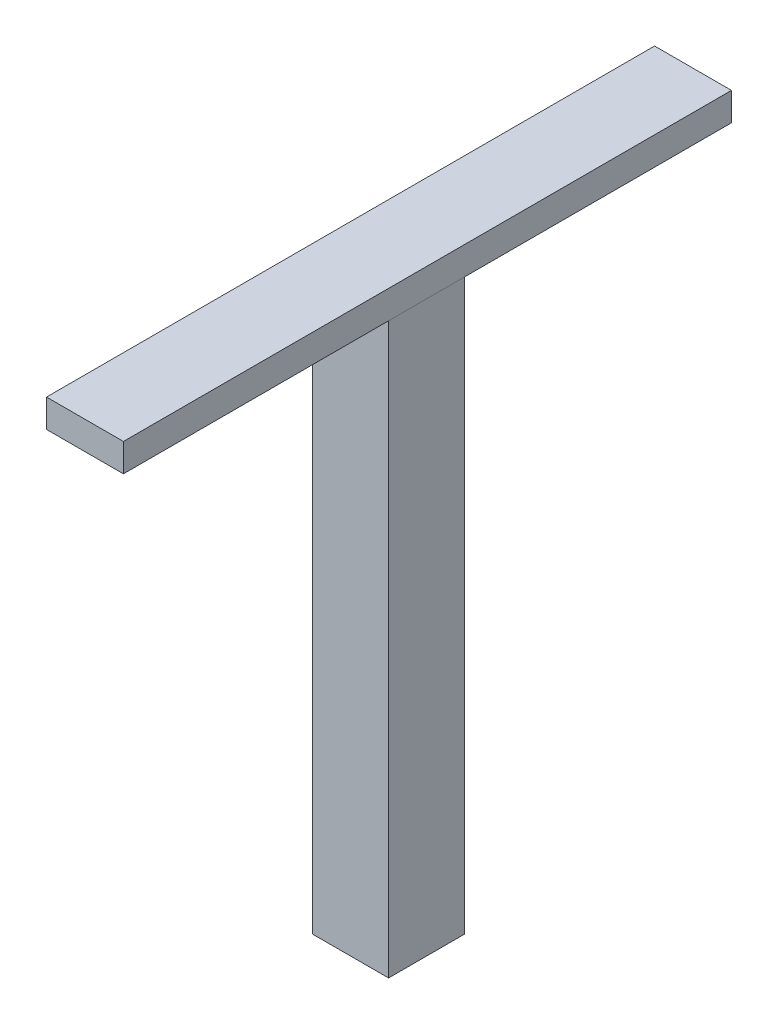
ISO-10303-21;
HEADER;
FILE_DESCRIPTION(('STEP AP214'),'2;1');
FILE_NAME('part.step','',(''),(''),'','','');
FILE_SCHEMA(('AUTOMOTIVE_DESIGN { 1 0 10303 214 1 1 1 1 }'));
ENDSEC;
DATA;
#1=APPLICATION_CONTEXT('core data for automotive mechanical design processes');
#2=APPLICATION_PROTOCOL_DEFINITION('international standard','automotive_design',2000,#1);
#3=PRODUCT_CONTEXT('',#1,'mechanical');
#4=PRODUCT('Part','Part','',(#3));
#5=PRODUCT_RELATED_PRODUCT_CATEGORY('part','',(#4));
#6=PRODUCT_DEFINITION_FORMATION('','',#4);
#7=PRODUCT_DEFINITION_CONTEXT('part definition',#1,'design');
#8=PRODUCT_DEFINITION('design','',#6,#7);
#9=PRODUCT_DEFINITION_SHAPE('','',#8);
#10=(LENGTH_UNIT() NAMED_UNIT(*) SI_UNIT(.MILLI.,.METRE.));
#11=(NAMED_UNIT(*) PLANE_ANGLE_UNIT() SI_UNIT($,.RADIAN.));
#12=(NAMED_UNIT(*) SI_UNIT($,.STERADIAN.) SOLID_ANGLE_UNIT());
#13=UNCERTAINTY_MEASURE_WITH_UNIT(LENGTH_MEASURE(1.E-05),#10,'distance_accuracy_value','');
#14=(GEOMETRIC_REPRESENTATION_CONTEXT(3) GLOBAL_UNCERTAINTY_ASSIGNED_CONTEXT((#13)) GLOBAL_UNIT_ASSIGNED_CONTEXT((#10,
#11,#12)) REPRESENTATION_CONTEXT('',''));
#15=CARTESIAN_POINT('',(0.,0.,0.));
#16=DIRECTION('',(0.,0.,1.));
#17=DIRECTION('',(1.,0.,0.));
#18=AXIS2_PLACEMENT_3D('',#15,#16,#17);
#19=CARTESIAN_POINT('',(0.,150.,-70.));
#20=DIRECTION('',(-1.,0.,0.));
#21=DIRECTION('',(0.,0.,1.));
#22=AXIS2_PLACEMENT_3D('',#19,#20,#21);
#23=PLANE('',#22);
#24=DIRECTION('',(0.,0.,1.));
#25=VECTOR('',#24,1.);
#26=CARTESIAN_POINT('',(0.,150.,-70.));
#27=LINE('',#26,#25);
#28=CARTESIAN_POINT('',(0.,150.,-70.));
#29=VERTEX_POINT('',#28);
#30=CARTESIAN_POINT('',(0.,150.,90.));
#31=VERTEX_POINT('',#30);
#32=EDGE_CURVE('E89',#29,#31,#27,.T.);
#33=ORIENTED_EDGE('',*,*,#32,.T.);
#34=DIRECTION('',(0.,-1.,0.));
#35=VECTOR('',#34,1.);
#36=CARTESIAN_POINT('',(0.,150.,90.));
#37=LINE('',#36,#35);
#38=CARTESIAN_POINT('',(0.,157.389232752848,90.));
#39=VERTEX_POINT('',#38);
#40=EDGE_CURVE('E126',#39,#31,#37,.T.);
#41=ORIENTED_EDGE('',*,*,#40,.F.);
#42=DIRECTION('',(0.,0.,1.));
#43=VECTOR('',#42,1.);
#44=CARTESIAN_POINT('',(0.,157.389232752848,-70.));
#45=LINE('',#44,#43);
#46=CARTESIAN_POINT('',(0.,157.389232752848,-70.));
#47=VERTEX_POINT('',#46);
#48=EDGE_CURVE('E13',#47,#39,#45,.T.);
#49=ORIENTED_EDGE('',*,*,#48,.F.);
#50=DIRECTION('',(0.,-1.,0.));
#51=VECTOR('',#50,1.);
#52=CARTESIAN_POINT('',(0.,150.,-70.));
#53=LINE('',#52,#51);
#54=EDGE_CURVE('E127',#47,#29,#53,.T.);
#55=ORIENTED_EDGE('',*,*,#54,.T.);
#56=EDGE_LOOP('',(#33,#41,#49,#55));
#57=FACE_BOUND('',#56,.T.);
#58=ADVANCED_FACE('F86',(#57),#23,.T.);
#59=CARTESIAN_POINT('',(0.,157.389232752848,-70.));
#60=DIRECTION('',(0.,1.,0.));
#61=DIRECTION('',(0.,0.,1.));
#62=AXIS2_PLACEMENT_3D('',#59,#60,#61);
#63=PLANE('',#62);
#64=ORIENTED_EDGE('',*,*,#48,.T.);
#65=DIRECTION('',(-1.,0.,0.));
#66=VECTOR('',#65,1.);
#67=CARTESIAN_POINT('',(0.,157.389232752848,90.));
#68=LINE('',#67,#66);
#69=CARTESIAN_POINT('',(20.2324941647625,157.389232752848,90.));
#70=VERTEX_POINT('',#69);
#71=EDGE_CURVE('E143',#70,#39,#68,.T.);
#72=ORIENTED_EDGE('',*,*,#71,.F.);
#73=DIRECTION('',(0.,0.,1.));
#74=VECTOR('',#73,1.);
#75=CARTESIAN_POINT('',(20.2324941647625,157.389232752848,-70.));
#76=LINE('',#75,#74);
#77=CARTESIAN_POINT('',(20.2324941647625,157.389232752848,-70.));
#78=VERTEX_POINT('',#77);
#79=EDGE_CURVE('E94',#78,#70,#76,.T.);
#80=ORIENTED_EDGE('',*,*,#79,.F.);
#81=DIRECTION('',(-1.,0.,0.));
#82=VECTOR('',#81,1.);
#83=CARTESIAN_POINT('',(0.,157.389232752848,-70.));
#84=LINE('',#83,#82);
#85=EDGE_CURVE('E132',#78,#47,#84,.T.);
#86=ORIENTED_EDGE('',*,*,#85,.T.);
#87=EDGE_LOOP('',(#64,#72,#80,#86));
#88=FACE_BOUND('',#87,.T.);
#89=ADVANCED_FACE('F158',(#88),#63,.T.);
#90=CARTESIAN_POINT('',(20.2324941647625,150.,-70.));
#91=DIRECTION('',(1.,0.,0.));
#92=DIRECTION('',(0.,0.,-1.));
#93=AXIS2_PLACEMENT_3D('',#90,#91,#92);
#94=PLANE('',#93);
#95=ORIENTED_EDGE('',*,*,#79,.T.);
#96=DIRECTION('',(0.,1.,0.));
#97=VECTOR('',#96,1.);
#98=CARTESIAN_POINT('',(20.2324941647625,150.,90.));
#99=LINE('',#98,#97);
#100=CARTESIAN_POINT('',(20.2324941647625,150.,90.));
#101=VERTEX_POINT('',#100);
#102=EDGE_CURVE('E139',#101,#70,#99,.T.);
#103=ORIENTED_EDGE('',*,*,#102,.F.);
#104=DIRECTION('',(0.,0.,1.));
#105=VECTOR('',#104,1.);
#106=CARTESIAN_POINT('',(20.2324941647625,150.,-70.));
#107=LINE('',#106,#105);
#108=CARTESIAN_POINT('',(20.2324941647625,150.,-70.));
#109=VERTEX_POINT('',#108);
#110=EDGE_CURVE('E131',#109,#101,#107,.T.);
#111=ORIENTED_EDGE('',*,*,#110,.F.);
#112=DIRECTION('',(0.,1.,0.));
#113=VECTOR('',#112,1.);
#114=CARTESIAN_POINT('',(20.2324941647625,150.,-70.));
#115=LINE('',#114,#113);
#116=EDGE_CURVE('E151',#109,#78,#115,.T.);
#117=ORIENTED_EDGE('',*,*,#116,.T.);
#118=EDGE_LOOP('',(#95,#103,#111,#117));
#119=FACE_BOUND('',#118,.T.);
#120=ADVANCED_FACE('F155',(#119),#94,.T.);
#121=CARTESIAN_POINT('',(0.,150.,-70.));
#122=DIRECTION('',(0.,-1.,0.));
#123=DIRECTION('',(0.,0.,-1.));
#124=AXIS2_PLACEMENT_3D('',#121,#122,#123);
#125=PLANE('',#124);
#126=ORIENTED_EDGE('',*,*,#110,.T.);
#127=DIRECTION('',(1.,0.,0.));
#128=VECTOR('',#127,1.);
#129=CARTESIAN_POINT('',(0.,150.,90.));
#130=LINE('',#129,#128);
#131=EDGE_CURVE('E134',#31,#101,#130,.T.);
#132=ORIENTED_EDGE('',*,*,#131,.F.);
#133=ORIENTED_EDGE('',*,*,#32,.F.);
#134=DIRECTION('',(1.,0.,0.));
#135=VECTOR('',#134,1.);
#136=CARTESIAN_POINT('',(0.,150.,-70.));
#137=LINE('',#136,#135);
#138=EDGE_CURVE('E149',#29,#109,#137,.T.);
#139=ORIENTED_EDGE('',*,*,#138,.T.);
#140=EDGE_LOOP('',(#126,#132,#133,#139));
#141=FACE_BOUND('',#140,.T.);
#142=ADVANCED_FACE('F135',(#141),#125,.T.);
#143=CARTESIAN_POINT('',(0.,0.,-70.));
#144=DIRECTION('',(0.,0.,-1.));
#145=DIRECTION('',(-1.,0.,0.));
#146=AXIS2_PLACEMENT_3D('',#143,#144,#145);
#147=PLANE('',#146);
#148=ORIENTED_EDGE('',*,*,#54,.F.);
#149=ORIENTED_EDGE('',*,*,#85,.F.);
#150=ORIENTED_EDGE('',*,*,#116,.F.);
#151=ORIENTED_EDGE('',*,*,#138,.F.);
#152=EDGE_LOOP('',(#148,#149,#150,#151));
#153=FACE_BOUND('',#152,.T.);
#154=ADVANCED_FACE('F160',(#153),#147,.T.);
#155=CARTESIAN_POINT('',(0.,0.,90.));
#156=DIRECTION('',(0.,0.,-1.));
#157=DIRECTION('',(-1.,0.,0.));
#158=AXIS2_PLACEMENT_3D('',#155,#156,#157);
#159=PLANE('',#158);
#160=ORIENTED_EDGE('',*,*,#40,.T.);
#161=ORIENTED_EDGE('',*,*,#131,.T.);
#162=ORIENTED_EDGE('',*,*,#102,.T.);
#163=ORIENTED_EDGE('',*,*,#71,.T.);
#164=EDGE_LOOP('',(#160,#161,#162,#163));
#165=FACE_BOUND('',#164,.T.);
#166=ADVANCED_FACE('F142',(#165),#159,.F.);
#167=CLOSED_SHELL('',(#58,#89,#120,#142,#154,#166));
#168=MANIFOLD_SOLID_BREP('B2',#167);
#169=CARTESIAN_POINT('',(0.,150.,0.));
#170=DIRECTION('',(0.,-1.,0.));
#171=DIRECTION('',(0.,0.,-1.));
#172=AXIS2_PLACEMENT_3D('',#169,#170,#171);
#173=PLANE('',#172);
#174=DIRECTION('',(1.,0.,0.));
#175=VECTOR('',#174,1.);
#176=CARTESIAN_POINT('',(0.,150.,20.));
#177=LINE('',#176,#175);
#178=CARTESIAN_POINT('',(0.,150.,20.));
#179=VERTEX_POINT('',#178);
#180=CARTESIAN_POINT('',(20.,150.,20.));
#181=VERTEX_POINT('',#180);
#182=EDGE_CURVE('E232',#179,#181,#177,.T.);
#183=ORIENTED_EDGE('',*,*,#182,.T.);
#184=DIRECTION('',(0.,0.,1.));
#185=VECTOR('',#184,1.);
#186=CARTESIAN_POINT('',(20.,150.,0.));
#187=LINE('',#186,#185);
#188=CARTESIAN_POINT('',(20.,150.,0.));
#189=VERTEX_POINT('',#188);
#190=EDGE_CURVE('E266',#189,#181,#187,.T.);
#191=ORIENTED_EDGE('',*,*,#190,.F.);
#192=DIRECTION('',(1.,0.,0.));
#193=VECTOR('',#192,1.);
#194=CARTESIAN_POINT('',(0.,150.,0.));
#195=LINE('',#194,#193);
#196=CARTESIAN_POINT('',(0.,150.,0.));
#197=VERTEX_POINT('',#196);
#198=EDGE_CURVE('E263',#197,#189,#195,.T.);
#199=ORIENTED_EDGE('',*,*,#198,.F.);
#200=DIRECTION('',(0.,0.,1.));
#201=VECTOR('',#200,1.);
#202=CARTESIAN_POINT('',(0.,150.,0.));
#203=LINE('',#202,#201);
#204=EDGE_CURVE('E260',#197,#179,#203,.T.);
#205=ORIENTED_EDGE('',*,*,#204,.T.);
#206=EDGE_LOOP('',(#183,#191,#199,#205));
#207=FACE_BOUND('',#206,.T.);
#208=ADVANCED_FACE('F222',(#207),#173,.F.);
#209=CARTESIAN_POINT('',(0.,0.,0.));
#210=DIRECTION('',(0.,-1.,0.));
#211=DIRECTION('',(0.,0.,-1.));
#212=AXIS2_PLACEMENT_3D('',#209,#210,#211);
#213=PLANE('',#212);
#214=DIRECTION('',(1.,0.,0.));
#215=VECTOR('',#214,1.);
#216=CARTESIAN_POINT('',(0.,0.,20.));
#217=LINE('',#216,#215);
#218=CARTESIAN_POINT('',(0.,0.,20.));
#219=VERTEX_POINT('',#218);
#220=CARTESIAN_POINT('',(20.,0.,20.));
#221=VERTEX_POINT('',#220);
#222=EDGE_CURVE('E84',#219,#221,#217,.T.);
#223=ORIENTED_EDGE('',*,*,#222,.F.);
#224=DIRECTION('',(0.,0.,1.));
#225=VECTOR('',#224,1.);
#226=CARTESIAN_POINT('',(0.,0.,0.));
#227=LINE('',#226,#225);
#228=CARTESIAN_POINT('',(0.,0.,0.));
#229=VERTEX_POINT('',#228);
#230=EDGE_CURVE('E281',#229,#219,#227,.T.);
#231=ORIENTED_EDGE('',*,*,#230,.F.);
#232=DIRECTION('',(1.,0.,0.));
#233=VECTOR('',#232,1.);
#234=CARTESIAN_POINT('',(0.,0.,0.));
#235=LINE('',#234,#233);
#236=CARTESIAN_POINT('',(20.,0.,0.));
#237=VERTEX_POINT('',#236);
#238=EDGE_CURVE('E271',#229,#237,#235,.T.);
#239=ORIENTED_EDGE('',*,*,#238,.T.);
#240=DIRECTION('',(0.,0.,1.));
#241=VECTOR('',#240,1.);
#242=CARTESIAN_POINT('',(20.,0.,0.));
#243=LINE('',#242,#241);
#244=EDGE_CURVE('E241',#237,#221,#243,.T.);
#245=ORIENTED_EDGE('',*,*,#244,.T.);
#246=EDGE_LOOP('',(#223,#231,#239,#245));
#247=FACE_BOUND('',#246,.T.);
#248=ADVANCED_FACE('F330',(#247),#213,.T.);
#249=CARTESIAN_POINT('',(0.,0.,0.));
#250=DIRECTION('',(-1.,0.,0.));
#251=DIRECTION('',(0.,0.,1.));
#252=AXIS2_PLACEMENT_3D('',#249,#250,#251);
#253=PLANE('',#252);
#254=ORIENTED_EDGE('',*,*,#204,.F.);
#255=DIRECTION('',(0.,1.,0.));
#256=VECTOR('',#255,1.);
#257=CARTESIAN_POINT('',(0.,0.,0.));
#258=LINE('',#257,#256);
#259=EDGE_CURVE('E276',#229,#197,#258,.T.);
#260=ORIENTED_EDGE('',*,*,#259,.F.);
#261=ORIENTED_EDGE('',*,*,#230,.T.);
#262=DIRECTION('',(0.,1.,0.));
#263=VECTOR('',#262,1.);
#264=CARTESIAN_POINT('',(0.,0.,20.));
#265=LINE('',#264,#263);
#266=EDGE_CURVE('E272',#219,#179,#265,.T.);
#267=ORIENTED_EDGE('',*,*,#266,.T.);
#268=EDGE_LOOP('',(#254,#260,#261,#267));
#269=FACE_BOUND('',#268,.T.);
#270=ADVANCED_FACE('F282',(#269),#253,.T.);
#271=CARTESIAN_POINT('',(0.,0.,20.));
#272=DIRECTION('',(0.,0.,1.));
#273=DIRECTION('',(1.,0.,0.));
#274=AXIS2_PLACEMENT_3D('',#271,#272,#273);
#275=PLANE('',#274);
#276=ORIENTED_EDGE('',*,*,#182,.F.);
#277=ORIENTED_EDGE('',*,*,#266,.F.);
#278=ORIENTED_EDGE('',*,*,#222,.T.);
#279=DIRECTION('',(0.,1.,0.));
#280=VECTOR('',#279,1.);
#281=CARTESIAN_POINT('',(20.,0.,20.));
#282=LINE('',#281,#280);
#283=EDGE_CURVE('E295',#221,#181,#282,.T.);
#284=ORIENTED_EDGE('',*,*,#283,.T.);
#285=EDGE_LOOP('',(#276,#277,#278,#284));
#286=FACE_BOUND('',#285,.T.);
#287=ADVANCED_FACE('F332',(#286),#275,.T.);
#288=CARTESIAN_POINT('',(0.,0.,0.));
#289=DIRECTION('',(0.,0.,1.));
#290=DIRECTION('',(1.,0.,0.));
#291=AXIS2_PLACEMENT_3D('',#288,#289,#290);
#292=PLANE('',#291);
#293=ORIENTED_EDGE('',*,*,#198,.T.);
#294=DIRECTION('',(0.,1.,0.));
#295=VECTOR('',#294,1.);
#296=CARTESIAN_POINT('',(20.,0.,0.));
#297=LINE('',#296,#295);
#298=EDGE_CURVE('E300',#237,#189,#297,.T.);
#299=ORIENTED_EDGE('',*,*,#298,.F.);
#300=ORIENTED_EDGE('',*,*,#238,.F.);
#301=ORIENTED_EDGE('',*,*,#259,.T.);
#302=EDGE_LOOP('',(#293,#299,#300,#301));
#303=FACE_BOUND('',#302,.T.);
#304=ADVANCED_FACE('F277',(#303),#292,.F.);
#305=CARTESIAN_POINT('',(20.,0.,0.));
#306=DIRECTION('',(-1.,0.,0.));
#307=DIRECTION('',(0.,0.,1.));
#308=AXIS2_PLACEMENT_3D('',#305,#306,#307);
#309=PLANE('',#308);
#310=ORIENTED_EDGE('',*,*,#190,.T.);
#311=ORIENTED_EDGE('',*,*,#283,.F.);
#312=ORIENTED_EDGE('',*,*,#244,.F.);
#313=ORIENTED_EDGE('',*,*,#298,.T.);
#314=EDGE_LOOP('',(#310,#311,#312,#313));
#315=FACE_BOUND('',#314,.T.);
#316=ADVANCED_FACE('F313',(#315),#309,.F.);
#317=CLOSED_SHELL('',(#208,#248,#270,#287,#304,#316));
#318=MANIFOLD_SOLID_BREP('B7',#317);
#319=ADVANCED_BREP_SHAPE_REPRESENTATION('',(#18,#168,#318),#14);
#320=SHAPE_DEFINITION_REPRESENTATION(#9,#319);
ENDSEC;
END-ISO-10303-21;
